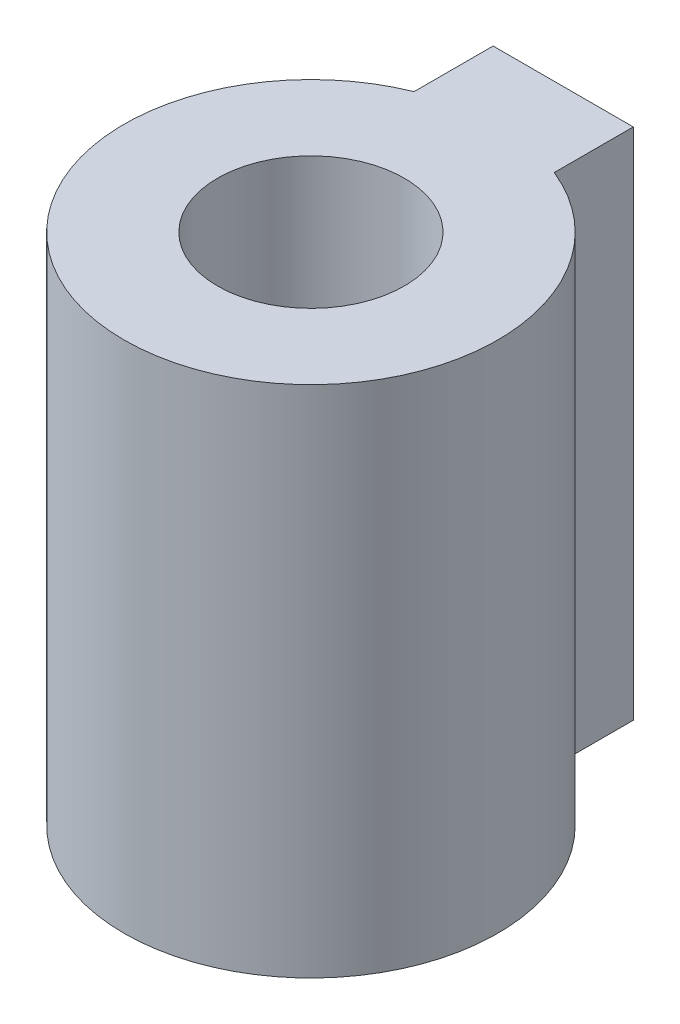
ISO-10303-21;
HEADER;
FILE_DESCRIPTION(('STEP AP214'),'2;1');
FILE_NAME('part.step','',(''),(''),'','','');
FILE_SCHEMA(('AUTOMOTIVE_DESIGN { 1 0 10303 214 1 1 1 1 }'));
ENDSEC;
DATA;
#1=APPLICATION_CONTEXT('core data for automotive mechanical design processes');
#2=APPLICATION_PROTOCOL_DEFINITION('international standard','automotive_design',2000,#1);
#3=PRODUCT_CONTEXT('',#1,'mechanical');
#4=PRODUCT('Part','Part','',(#3));
#5=PRODUCT_RELATED_PRODUCT_CATEGORY('part','',(#4));
#6=PRODUCT_DEFINITION_FORMATION('','',#4);
#7=PRODUCT_DEFINITION_CONTEXT('part definition',#1,'design');
#8=PRODUCT_DEFINITION('design','',#6,#7);
#9=PRODUCT_DEFINITION_SHAPE('','',#8);
#10=(LENGTH_UNIT() NAMED_UNIT(*) SI_UNIT(.MILLI.,.METRE.));
#11=(NAMED_UNIT(*) PLANE_ANGLE_UNIT() SI_UNIT($,.RADIAN.));
#12=(NAMED_UNIT(*) SI_UNIT($,.STERADIAN.) SOLID_ANGLE_UNIT());
#13=UNCERTAINTY_MEASURE_WITH_UNIT(LENGTH_MEASURE(1.E-05),#10,'distance_accuracy_value','');
#14=(GEOMETRIC_REPRESENTATION_CONTEXT(3) GLOBAL_UNCERTAINTY_ASSIGNED_CONTEXT((#13)) GLOBAL_UNIT_ASSIGNED_CONTEXT((#10,
#11,#12)) REPRESENTATION_CONTEXT('',''));
#15=CARTESIAN_POINT('',(0.,0.,0.));
#16=DIRECTION('',(0.,0.,1.));
#17=DIRECTION('',(1.,0.,0.));
#18=AXIS2_PLACEMENT_3D('',#15,#16,#17);
#19=CARTESIAN_POINT('',(0.,10.,0.));
#20=DIRECTION('',(0.,-1.,0.));
#21=DIRECTION('',(0.,0.,-1.));
#22=AXIS2_PLACEMENT_3D('',#19,#20,#21);
#23=CYLINDRICAL_SURFACE('',#22,4.);
#24=CARTESIAN_POINT('',(0.,11.,0.));
#25=DIRECTION('',(0.,1.,0.));
#26=DIRECTION('',(0.,0.,1.));
#27=AXIS2_PLACEMENT_3D('',#24,#25,#26);
#28=CIRCLE('',#27,4.);
#29=CARTESIAN_POINT('',(-1.5,11.,-3.70809924354783));
#30=VERTEX_POINT('',#29);
#31=CARTESIAN_POINT('',(1.5,11.,-3.70809924354783));
#32=VERTEX_POINT('',#31);
#33=EDGE_CURVE('E84',#30,#32,#28,.T.);
#34=ORIENTED_EDGE('',*,*,#33,.F.);
#35=DIRECTION('',(0.,-1.,0.));
#36=VECTOR('',#35,1.);
#37=CARTESIAN_POINT('',(-1.5,10.,-3.70809924354783));
#38=LINE('',#37,#36);
#39=CARTESIAN_POINT('',(-1.5,0.,-3.70809924354783));
#40=VERTEX_POINT('',#39);
#41=EDGE_CURVE('E58',#30,#40,#38,.T.);
#42=ORIENTED_EDGE('',*,*,#41,.T.);
#43=CARTESIAN_POINT('',(0.,0.,0.));
#44=DIRECTION('',(0.,1.,0.));
#45=DIRECTION('',(0.,0.,1.));
#46=AXIS2_PLACEMENT_3D('',#43,#44,#45);
#47=CIRCLE('',#46,4.);
#48=CARTESIAN_POINT('',(1.5,0.,-3.70809924354783));
#49=VERTEX_POINT('',#48);
#50=EDGE_CURVE('E85',#40,#49,#47,.T.);
#51=ORIENTED_EDGE('',*,*,#50,.T.);
#52=DIRECTION('',(0.,-1.,0.));
#53=VECTOR('',#52,1.);
#54=CARTESIAN_POINT('',(1.5,10.,-3.70809924354783));
#55=LINE('',#54,#53);
#56=EDGE_CURVE('E12',#32,#49,#55,.T.);
#57=ORIENTED_EDGE('',*,*,#56,.F.);
#58=EDGE_LOOP('',(#34,#42,#51,#57));
#59=FACE_BOUND('',#58,.T.);
#60=ADVANCED_FACE('F43',(#59),#23,.T.);
#61=CARTESIAN_POINT('',(1.5,10.,0.));
#62=DIRECTION('',(-1.,0.,0.));
#63=DIRECTION('',(0.,0.,1.));
#64=AXIS2_PLACEMENT_3D('',#61,#62,#63);
#65=PLANE('',#64);
#66=DIRECTION('',(0.,0.,-1.));
#67=VECTOR('',#66,1.);
#68=CARTESIAN_POINT('',(1.5,0.,0.));
#69=LINE('',#68,#67);
#70=CARTESIAN_POINT('',(1.5,0.,-5.4));
#71=VERTEX_POINT('',#70);
#72=EDGE_CURVE('E100',#49,#71,#69,.T.);
#73=ORIENTED_EDGE('',*,*,#72,.T.);
#74=DIRECTION('',(0.,-1.,0.));
#75=VECTOR('',#74,1.);
#76=CARTESIAN_POINT('',(1.5,10.,-5.4));
#77=LINE('',#76,#75);
#78=CARTESIAN_POINT('',(1.5,11.,-5.4));
#79=VERTEX_POINT('',#78);
#80=EDGE_CURVE('E51',#79,#71,#77,.T.);
#81=ORIENTED_EDGE('',*,*,#80,.F.);
#82=DIRECTION('',(0.,0.,-1.));
#83=VECTOR('',#82,1.);
#84=CARTESIAN_POINT('',(1.5,11.,0.));
#85=LINE('',#84,#83);
#86=EDGE_CURVE('E89',#32,#79,#85,.T.);
#87=ORIENTED_EDGE('',*,*,#86,.F.);
#88=ORIENTED_EDGE('',*,*,#56,.T.);
#89=EDGE_LOOP('',(#73,#81,#87,#88));
#90=FACE_BOUND('',#89,.T.);
#91=ADVANCED_FACE('F90',(#90),#65,.F.);
#92=CARTESIAN_POINT('',(0.,10.,-5.4));
#93=DIRECTION('',(0.,0.,-1.));
#94=DIRECTION('',(-1.,0.,0.));
#95=AXIS2_PLACEMENT_3D('',#92,#93,#94);
#96=PLANE('',#95);
#97=DIRECTION('',(1.,0.,0.));
#98=VECTOR('',#97,1.);
#99=CARTESIAN_POINT('',(0.,0.,-5.4));
#100=LINE('',#99,#98);
#101=CARTESIAN_POINT('',(-1.5,0.,-5.4));
#102=VERTEX_POINT('',#101);
#103=EDGE_CURVE('E108',#102,#71,#100,.T.);
#104=ORIENTED_EDGE('',*,*,#103,.F.);
#105=DIRECTION('',(0.,-1.,0.));
#106=VECTOR('',#105,1.);
#107=CARTESIAN_POINT('',(-1.5,10.,-5.4));
#108=LINE('',#107,#106);
#109=CARTESIAN_POINT('',(-1.5,11.,-5.4));
#110=VERTEX_POINT('',#109);
#111=EDGE_CURVE('E115',#110,#102,#108,.T.);
#112=ORIENTED_EDGE('',*,*,#111,.F.);
#113=DIRECTION('',(-1.,0.,0.));
#114=VECTOR('',#113,1.);
#115=CARTESIAN_POINT('',(0.,11.,-5.4));
#116=LINE('',#115,#114);
#117=EDGE_CURVE('E94',#79,#110,#116,.T.);
#118=ORIENTED_EDGE('',*,*,#117,.F.);
#119=ORIENTED_EDGE('',*,*,#80,.T.);
#120=EDGE_LOOP('',(#104,#112,#118,#119));
#121=FACE_BOUND('',#120,.T.);
#122=ADVANCED_FACE('F119',(#121),#96,.T.);
#123=CARTESIAN_POINT('',(-1.5,10.,0.));
#124=DIRECTION('',(-1.,0.,0.));
#125=DIRECTION('',(0.,0.,1.));
#126=AXIS2_PLACEMENT_3D('',#123,#124,#125);
#127=PLANE('',#126);
#128=DIRECTION('',(0.,0.,-1.));
#129=VECTOR('',#128,1.);
#130=CARTESIAN_POINT('',(-1.5,0.,0.));
#131=LINE('',#130,#129);
#132=EDGE_CURVE('E111',#40,#102,#131,.T.);
#133=ORIENTED_EDGE('',*,*,#132,.F.);
#134=ORIENTED_EDGE('',*,*,#41,.F.);
#135=DIRECTION('',(0.,0.,1.));
#136=VECTOR('',#135,1.);
#137=CARTESIAN_POINT('',(-1.5,11.,0.));
#138=LINE('',#137,#136);
#139=EDGE_CURVE('E95',#110,#30,#138,.T.);
#140=ORIENTED_EDGE('',*,*,#139,.F.);
#141=ORIENTED_EDGE('',*,*,#111,.T.);
#142=EDGE_LOOP('',(#133,#134,#140,#141));
#143=FACE_BOUND('',#142,.T.);
#144=ADVANCED_FACE('F122',(#143),#127,.T.);
#145=CARTESIAN_POINT('',(0.,0.,0.));
#146=DIRECTION('',(0.,1.,0.));
#147=DIRECTION('',(0.,0.,1.));
#148=AXIS2_PLACEMENT_3D('',#145,#146,#147);
#149=PLANE('',#148);
#150=CARTESIAN_POINT('',(0.,0.,0.));
#151=DIRECTION('',(0.,-1.,0.));
#152=DIRECTION('',(0.,0.,-1.));
#153=AXIS2_PLACEMENT_3D('',#150,#151,#152);
#154=CIRCLE('',#153,2.);
#155=CARTESIAN_POINT('',(0.,0.,-2.));
#156=VERTEX_POINT('',#155);
#157=EDGE_CURVE('E130',#156,#156,#154,.T.);
#158=ORIENTED_EDGE('',*,*,#157,.F.);
#159=EDGE_LOOP('',(#158));
#160=FACE_BOUND('',#159,.T.);
#161=ORIENTED_EDGE('',*,*,#50,.F.);
#162=ORIENTED_EDGE('',*,*,#132,.T.);
#163=ORIENTED_EDGE('',*,*,#103,.T.);
#164=ORIENTED_EDGE('',*,*,#72,.F.);
#165=EDGE_LOOP('',(#161,#162,#163,#164));
#166=FACE_BOUND('',#165,.T.);
#167=ADVANCED_FACE('F121',(#160,#166),#149,.F.);
#168=CARTESIAN_POINT('',(0.,11.,0.));
#169=DIRECTION('',(0.,1.,0.));
#170=DIRECTION('',(0.,0.,1.));
#171=AXIS2_PLACEMENT_3D('',#168,#169,#170);
#172=PLANE('',#171);
#173=CARTESIAN_POINT('',(0.,11.,0.));
#174=DIRECTION('',(0.,1.,0.));
#175=DIRECTION('',(0.,0.,1.));
#176=AXIS2_PLACEMENT_3D('',#173,#174,#175);
#177=CIRCLE('',#176,2.);
#178=CARTESIAN_POINT('',(0.,11.,2.));
#179=VERTEX_POINT('',#178);
#180=EDGE_CURVE('E103',#179,#179,#177,.T.);
#181=ORIENTED_EDGE('',*,*,#180,.F.);
#182=EDGE_LOOP('',(#181));
#183=FACE_BOUND('',#182,.T.);
#184=ORIENTED_EDGE('',*,*,#33,.T.);
#185=ORIENTED_EDGE('',*,*,#86,.T.);
#186=ORIENTED_EDGE('',*,*,#117,.T.);
#187=ORIENTED_EDGE('',*,*,#139,.T.);
#188=EDGE_LOOP('',(#184,#185,#186,#187));
#189=FACE_BOUND('',#188,.T.);
#190=ADVANCED_FACE('F97',(#183,#189),#172,.T.);
#191=CARTESIAN_POINT('',(0.,8.,0.));
#192=DIRECTION('',(0.,1.,0.));
#193=DIRECTION('',(0.,0.,1.));
#194=AXIS2_PLACEMENT_3D('',#191,#192,#193);
#195=CYLINDRICAL_SURFACE('',#194,2.);
#196=CARTESIAN_POINT('',(0.,8.,0.));
#197=DIRECTION('',(0.,1.,0.));
#198=DIRECTION('',(0.,0.,1.));
#199=AXIS2_PLACEMENT_3D('',#196,#197,#198);
#200=CIRCLE('',#199,2.);
#201=CARTESIAN_POINT('',(0.,8.,2.));
#202=VERTEX_POINT('',#201);
#203=EDGE_CURVE('E98',#202,#202,#200,.T.);
#204=ORIENTED_EDGE('',*,*,#203,.F.);
#205=EDGE_LOOP('',(#204));
#206=FACE_BOUND('',#205,.T.);
#207=ORIENTED_EDGE('',*,*,#180,.T.);
#208=EDGE_LOOP('',(#207));
#209=FACE_BOUND('',#208,.T.);
#210=ADVANCED_FACE('F146',(#206,#209),#195,.F.);
#211=CARTESIAN_POINT('',(0.,8.,0.));
#212=DIRECTION('',(0.,1.,0.));
#213=DIRECTION('',(0.,0.,1.));
#214=AXIS2_PLACEMENT_3D('',#211,#212,#213);
#215=PLANE('',#214);
#216=CARTESIAN_POINT('',(0.,8.,0.));
#217=DIRECTION('',(0.,1.,0.));
#218=DIRECTION('',(0.,0.,1.));
#219=AXIS2_PLACEMENT_3D('',#216,#217,#218);
#220=CIRCLE('',#219,0.5);
#221=CARTESIAN_POINT('',(0.,8.,0.5));
#222=VERTEX_POINT('',#221);
#223=EDGE_CURVE('E46',#222,#222,#220,.T.);
#224=ORIENTED_EDGE('',*,*,#223,.F.);
#225=EDGE_LOOP('',(#224));
#226=FACE_BOUND('',#225,.T.);
#227=ORIENTED_EDGE('',*,*,#203,.T.);
#228=EDGE_LOOP('',(#227));
#229=FACE_BOUND('',#228,.T.);
#230=ADVANCED_FACE('F142',(#226,#229),#215,.T.);
#231=CARTESIAN_POINT('',(0.,7.,0.));
#232=DIRECTION('',(0.,1.,0.));
#233=DIRECTION('',(0.,0.,1.));
#234=AXIS2_PLACEMENT_3D('',#231,#232,#233);
#235=PLANE('',#234);
#236=CARTESIAN_POINT('',(0.,7.,0.));
#237=DIRECTION('',(0.,-1.,0.));
#238=DIRECTION('',(0.,0.,-1.));
#239=AXIS2_PLACEMENT_3D('',#236,#237,#238);
#240=CIRCLE('',#239,0.5);
#241=CARTESIAN_POINT('',(0.,7.,-0.5));
#242=VERTEX_POINT('',#241);
#243=EDGE_CURVE('E133',#242,#242,#240,.T.);
#244=ORIENTED_EDGE('',*,*,#243,.F.);
#245=EDGE_LOOP('',(#244));
#246=FACE_BOUND('',#245,.T.);
#247=CARTESIAN_POINT('',(0.,7.,0.));
#248=DIRECTION('',(0.,1.,0.));
#249=DIRECTION('',(0.,0.,1.));
#250=AXIS2_PLACEMENT_3D('',#247,#248,#249);
#251=CIRCLE('',#250,2.);
#252=CARTESIAN_POINT('',(0.,7.,2.));
#253=VERTEX_POINT('',#252);
#254=EDGE_CURVE('E127',#253,#253,#251,.F.);
#255=ORIENTED_EDGE('',*,*,#254,.T.);
#256=EDGE_LOOP('',(#255));
#257=FACE_BOUND('',#256,.T.);
#258=ADVANCED_FACE('F145',(#246,#257),#235,.F.);
#259=CARTESIAN_POINT('',(0.,13.6568542494924,0.));
#260=DIRECTION('',(0.,-1.,0.));
#261=DIRECTION('',(0.,0.,-1.));
#262=AXIS2_PLACEMENT_3D('',#259,#260,#261);
#263=CYLINDRICAL_SURFACE('',#262,2.);
#264=ORIENTED_EDGE('',*,*,#157,.T.);
#265=EDGE_LOOP('',(#264));
#266=FACE_BOUND('',#265,.T.);
#267=ORIENTED_EDGE('',*,*,#254,.F.);
#268=EDGE_LOOP('',(#267));
#269=FACE_BOUND('',#268,.T.);
#270=ADVANCED_FACE('F189',(#266,#269),#263,.F.);
#271=CARTESIAN_POINT('',(0.,11.,0.));
#272=DIRECTION('',(0.,-1.,0.));
#273=DIRECTION('',(0.,0.,-1.));
#274=AXIS2_PLACEMENT_3D('',#271,#272,#273);
#275=CYLINDRICAL_SURFACE('',#274,0.5);
#276=ORIENTED_EDGE('',*,*,#223,.T.);
#277=EDGE_LOOP('',(#276));
#278=FACE_BOUND('',#277,.T.);
#279=ORIENTED_EDGE('',*,*,#243,.T.);
#280=EDGE_LOOP('',(#279));
#281=FACE_BOUND('',#280,.T.);
#282=ADVANCED_FACE('F140',(#278,#281),#275,.F.);
#283=CLOSED_SHELL('',(#60,#91,#122,#144,#167,#190,#210,#230,#258,#270,#282));
#284=MANIFOLD_SOLID_BREP('B2',#283);
#285=ADVANCED_BREP_SHAPE_REPRESENTATION('',(#18,#284),#14);
#286=SHAPE_DEFINITION_REPRESENTATION(#9,#285);
ENDSEC;
END-ISO-10303-21;
